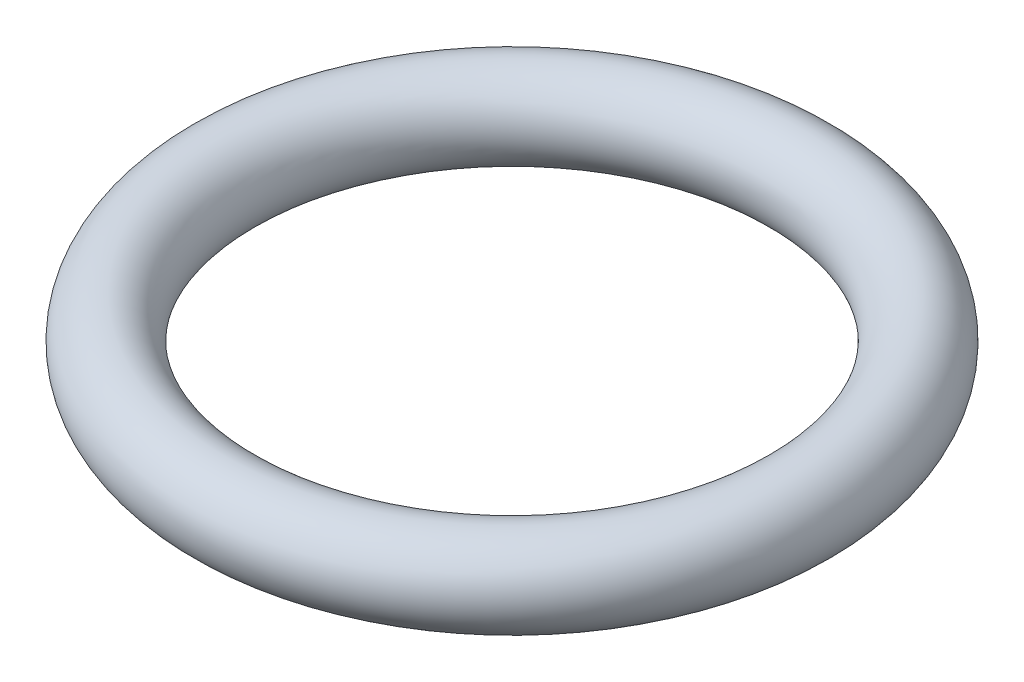
ISO-10303-21;
HEADER;
FILE_DESCRIPTION(('STEP AP214'),'2;1');
FILE_NAME('part.step','',(''),(''),'','','');
FILE_SCHEMA(('AUTOMOTIVE_DESIGN { 1 0 10303 214 1 1 1 1 }'));
ENDSEC;
DATA;
#1=APPLICATION_CONTEXT('core data for automotive mechanical design processes');
#2=APPLICATION_PROTOCOL_DEFINITION('international standard','automotive_design',2000,#1);
#3=PRODUCT_CONTEXT('',#1,'mechanical');
#4=PRODUCT('Part','Part','',(#3));
#5=PRODUCT_RELATED_PRODUCT_CATEGORY('part','',(#4));
#6=PRODUCT_DEFINITION_FORMATION('','',#4);
#7=PRODUCT_DEFINITION_CONTEXT('part definition',#1,'design');
#8=PRODUCT_DEFINITION('design','',#6,#7);
#9=PRODUCT_DEFINITION_SHAPE('','',#8);
#10=(LENGTH_UNIT() NAMED_UNIT(*) SI_UNIT(.MILLI.,.METRE.));
#11=(NAMED_UNIT(*) PLANE_ANGLE_UNIT() SI_UNIT($,.RADIAN.));
#12=(NAMED_UNIT(*) SI_UNIT($,.STERADIAN.) SOLID_ANGLE_UNIT());
#13=UNCERTAINTY_MEASURE_WITH_UNIT(LENGTH_MEASURE(1.E-05),#10,'distance_accuracy_value','');
#14=(GEOMETRIC_REPRESENTATION_CONTEXT(3) GLOBAL_UNCERTAINTY_ASSIGNED_CONTEXT((#13)) GLOBAL_UNIT_ASSIGNED_CONTEXT((#10,
#11,#12)) REPRESENTATION_CONTEXT('',''));
#15=CARTESIAN_POINT('',(0.,0.,0.));
#16=DIRECTION('',(0.,0.,1.));
#17=DIRECTION('',(1.,0.,0.));
#18=AXIS2_PLACEMENT_3D('',#15,#16,#17);
#19=CARTESIAN_POINT('',(0.,0.,0.));
#20=DIRECTION('',(0.,-1.,0.));
#21=DIRECTION('',(1.,0.,0.));
#22=AXIS2_PLACEMENT_3D('',#19,#20,#21);
#23=TOROIDAL_SURFACE('',#22,5.3848,0.79375);
#24=CARTESIAN_POINT('',(6.17855,0.,0.));
#25=VERTEX_POINT('',#24);
#26=VERTEX_LOOP('',#25);
#27=FACE_BOUND('',#26,.T.);
#28=ADVANCED_FACE('F33',(#27),#23,.T.);
#29=CLOSED_SHELL('',(#28));
#30=MANIFOLD_SOLID_BREP('B2',#29);
#31=ADVANCED_BREP_SHAPE_REPRESENTATION('',(#18,#30),#14);
#32=SHAPE_DEFINITION_REPRESENTATION(#9,#31);
ENDSEC;
END-ISO-10303-21;
